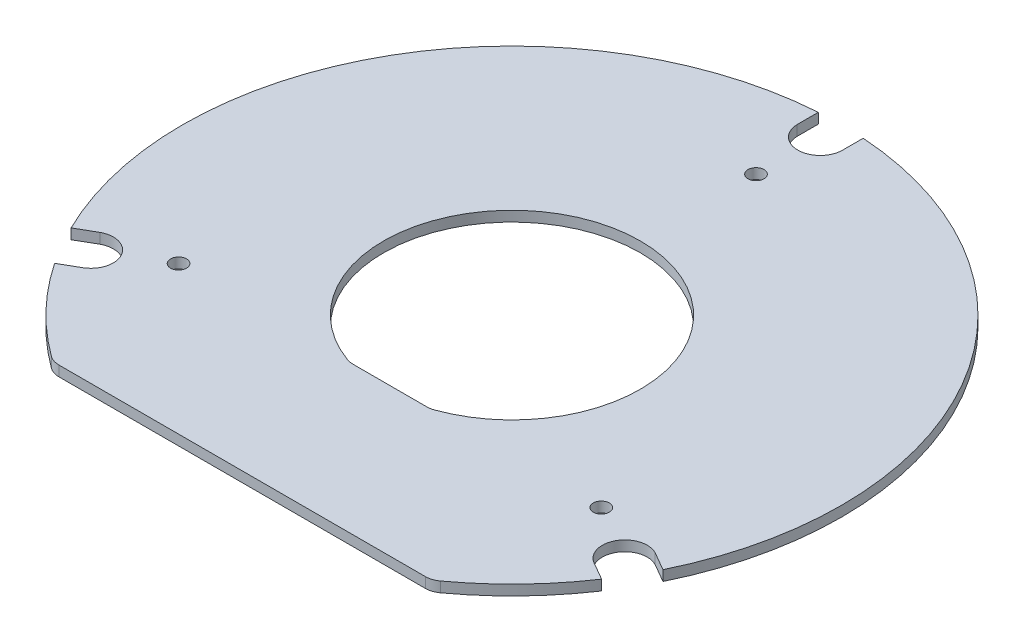
ISO-10303-21;
HEADER;
FILE_DESCRIPTION(('STEP AP214'),'2;1');
FILE_NAME('part.step','',(''),(''),'','','');
FILE_SCHEMA(('AUTOMOTIVE_DESIGN { 1 0 10303 214 1 1 1 1 }'));
ENDSEC;
DATA;
#1=APPLICATION_CONTEXT('core data for automotive mechanical design processes');
#2=APPLICATION_PROTOCOL_DEFINITION('international standard','automotive_design',2000,#1);
#3=PRODUCT_CONTEXT('',#1,'mechanical');
#4=PRODUCT('Part','Part','',(#3));
#5=PRODUCT_RELATED_PRODUCT_CATEGORY('part','',(#4));
#6=PRODUCT_DEFINITION_FORMATION('','',#4);
#7=PRODUCT_DEFINITION_CONTEXT('part definition',#1,'design');
#8=PRODUCT_DEFINITION('design','',#6,#7);
#9=PRODUCT_DEFINITION_SHAPE('','',#8);
#10=(LENGTH_UNIT() NAMED_UNIT(*) SI_UNIT(.MILLI.,.METRE.));
#11=(NAMED_UNIT(*) PLANE_ANGLE_UNIT() SI_UNIT($,.RADIAN.));
#12=(NAMED_UNIT(*) SI_UNIT($,.STERADIAN.) SOLID_ANGLE_UNIT());
#13=UNCERTAINTY_MEASURE_WITH_UNIT(LENGTH_MEASURE(1.E-05),#10,'distance_accuracy_value','');
#14=(GEOMETRIC_REPRESENTATION_CONTEXT(3) GLOBAL_UNCERTAINTY_ASSIGNED_CONTEXT((#13)) GLOBAL_UNIT_ASSIGNED_CONTEXT((#10,
#11,#12)) REPRESENTATION_CONTEXT('',''));
#15=CARTESIAN_POINT('',(0.,0.,0.));
#16=DIRECTION('',(0.,0.,1.));
#17=DIRECTION('',(1.,0.,0.));
#18=AXIS2_PLACEMENT_3D('',#15,#16,#17);
#19=CARTESIAN_POINT('',(0.,10.,42.0000000000002));
#20=DIRECTION('',(0.,0.,-1.));
#21=DIRECTION('',(-1.,0.,0.));
#22=AXIS2_PLACEMENT_3D('',#19,#20,#21);
#23=PLANE('',#22);
#24=DIRECTION('',(1.,0.,0.));
#25=VECTOR('',#24,1.);
#26=CARTESIAN_POINT('',(0.,10.,42.0000000000002));
#27=LINE('',#26,#25);
#28=CARTESIAN_POINT('',(-28.5132970067189,10.,42.0000000000002));
#29=VERTEX_POINT('',#28);
#30=CARTESIAN_POINT('',(28.5132970067189,10.,42.0000000000002));
#31=VERTEX_POINT('',#30);
#32=EDGE_CURVE('E190',#29,#31,#27,.T.);
#33=ORIENTED_EDGE('',*,*,#32,.F.);
#34=DIRECTION('',(0.,-1.,0.));
#35=VECTOR('',#34,1.);
#36=CARTESIAN_POINT('',(-28.5132970067189,10.,42.0000000000002));
#37=LINE('',#36,#35);
#38=CARTESIAN_POINT('',(-28.5132970067189,8.4,42.0000000000002));
#39=VERTEX_POINT('',#38);
#40=EDGE_CURVE('E304',#29,#39,#37,.T.);
#41=ORIENTED_EDGE('',*,*,#40,.T.);
#42=DIRECTION('',(1.,0.,0.));
#43=VECTOR('',#42,1.);
#44=CARTESIAN_POINT('',(0.,8.4,42.0000000000002));
#45=LINE('',#44,#43);
#46=CARTESIAN_POINT('',(28.5132970067189,8.4,42.0000000000002));
#47=VERTEX_POINT('',#46);
#48=EDGE_CURVE('E246',#39,#47,#45,.T.);
#49=ORIENTED_EDGE('',*,*,#48,.T.);
#50=DIRECTION('',(0.,-1.,0.));
#51=VECTOR('',#50,1.);
#52=CARTESIAN_POINT('',(28.5132970067189,10.,42.0000000000002));
#53=LINE('',#52,#51);
#54=EDGE_CURVE('E202',#47,#31,#53,.F.);
#55=ORIENTED_EDGE('',*,*,#54,.T.);
#56=EDGE_LOOP('',(#33,#41,#49,#55));
#57=FACE_BOUND('',#56,.T.);
#58=ADVANCED_FACE('F41',(#57),#23,.F.);
#59=CARTESIAN_POINT('',(0.,10.,0.));
#60=DIRECTION('',(0.,-1.,0.));
#61=DIRECTION('',(0.,0.,-1.));
#62=AXIS2_PLACEMENT_3D('',#59,#60,#61);
#63=CYLINDRICAL_SURFACE('',#62,51.3115732117407);
#64=CARTESIAN_POINT('',(0.,10.,0.));
#65=DIRECTION('',(0.,1.,0.));
#66=DIRECTION('',(0.,0.,1.));
#67=AXIS2_PLACEMENT_3D('',#64,#65,#66);
#68=CIRCLE('',#67,51.3115732117407);
#69=CARTESIAN_POINT('',(30.2838849907875,10.,41.4217799633065));
#70=VERTEX_POINT('',#69);
#71=CARTESIAN_POINT('',(42.5849301614049,10.,28.6251859140179));
#72=VERTEX_POINT('',#71);
#73=EDGE_CURVE('E178',#70,#72,#68,.T.);
#74=ORIENTED_EDGE('',*,*,#73,.F.);
#75=DIRECTION('',(0.,-1.,0.));
#76=VECTOR('',#75,1.);
#77=CARTESIAN_POINT('',(30.2838849907875,10.,41.4217799633065));
#78=LINE('',#77,#76);
#79=CARTESIAN_POINT('',(30.2838849907875,8.4,41.4217799633065));
#80=VERTEX_POINT('',#79);
#81=EDGE_CURVE('E316',#70,#80,#78,.T.);
#82=ORIENTED_EDGE('',*,*,#81,.T.);
#83=CARTESIAN_POINT('',(0.,8.4,0.));
#84=DIRECTION('',(0.,1.,0.));
#85=DIRECTION('',(0.,0.,1.));
#86=AXIS2_PLACEMENT_3D('',#83,#84,#85);
#87=CIRCLE('',#86,51.3115732117407);
#88=CARTESIAN_POINT('',(42.5849301614049,8.4,28.6251859140179));
#89=VERTEX_POINT('',#88);
#90=EDGE_CURVE('E198',#80,#89,#87,.T.);
#91=ORIENTED_EDGE('',*,*,#90,.T.);
#92=DIRECTION('',(0.,-1.,0.));
#93=VECTOR('',#92,1.);
#94=CARTESIAN_POINT('',(42.5849301614049,10.,28.6251859140179));
#95=LINE('',#94,#93);
#96=EDGE_CURVE('E195',#72,#89,#95,.T.);
#97=ORIENTED_EDGE('',*,*,#96,.F.);
#98=EDGE_LOOP('',(#74,#82,#91,#97));
#99=FACE_BOUND('',#98,.T.);
#100=ADVANCED_FACE('F196',(#99),#63,.T.);
#101=CARTESIAN_POINT('',(-1.74883655444479,10.,3.02907376643207));
#102=DIRECTION('',(0.5,0.,-0.866025403784439));
#103=DIRECTION('',(-0.866025403784439,0.,-0.5));
#104=AXIS2_PLACEMENT_3D('',#101,#102,#103);
#105=PLANE('',#104);
#106=DIRECTION('',(0.866025403784439,0.,0.5));
#107=VECTOR('',#106,1.);
#108=CARTESIAN_POINT('',(-1.74883655444479,8.4,3.02907376643207));
#109=LINE('',#108,#107);
#110=CARTESIAN_POINT('',(39.7098743772462,8.4,26.9652716830987));
#111=VERTEX_POINT('',#110);
#112=EDGE_CURVE('E250',#111,#89,#109,.T.);
#113=ORIENTED_EDGE('',*,*,#112,.F.);
#114=DIRECTION('',(0.,-1.,0.));
#115=VECTOR('',#114,1.);
#116=CARTESIAN_POINT('',(39.7098743772462,10.,26.9652716830987));
#117=LINE('',#116,#115);
#118=CARTESIAN_POINT('',(39.7098743772462,10.,26.9652716830987));
#119=VERTEX_POINT('',#118);
#120=EDGE_CURVE('E203',#119,#111,#117,.T.);
#121=ORIENTED_EDGE('',*,*,#120,.F.);
#122=DIRECTION('',(0.866025403784439,0.,0.5));
#123=VECTOR('',#122,1.);
#124=CARTESIAN_POINT('',(-1.74883655444479,10.,3.02907376643207));
#125=LINE('',#124,#123);
#126=EDGE_CURVE('E185',#119,#72,#125,.T.);
#127=ORIENTED_EDGE('',*,*,#126,.T.);
#128=ORIENTED_EDGE('',*,*,#96,.T.);
#129=EDGE_LOOP('',(#113,#121,#127,#128));
#130=FACE_BOUND('',#129,.T.);
#131=ADVANCED_FACE('F205',(#130),#105,.T.);
#132=CARTESIAN_POINT('',(41.5692193816531,10.,24.));
#133=DIRECTION('',(0.,-1.,0.));
#134=DIRECTION('',(0.,0.,-1.));
#135=AXIS2_PLACEMENT_3D('',#132,#133,#134);
#136=CYLINDRICAL_SURFACE('',#135,3.5);
#137=CARTESIAN_POINT('',(41.5692193816531,8.4,24.));
#138=DIRECTION('',(0.,1.,0.));
#139=DIRECTION('',(0.,0.,1.));
#140=AXIS2_PLACEMENT_3D('',#137,#138,#139);
#141=CIRCLE('',#140,3.5);
#142=CARTESIAN_POINT('',(43.2075474861358,8.4,20.9071241502346));
#143=VERTEX_POINT('',#142);
#144=EDGE_CURVE('E254',#143,#111,#141,.T.);
#145=ORIENTED_EDGE('',*,*,#144,.F.);
#146=DIRECTION('',(0.,-1.,0.));
#147=VECTOR('',#146,1.);
#148=CARTESIAN_POINT('',(43.2075474861358,10.,20.9071241502346));
#149=LINE('',#148,#147);
#150=CARTESIAN_POINT('',(43.2075474861358,10.,20.9071241502346));
#151=VERTEX_POINT('',#150);
#152=EDGE_CURVE('E300',#151,#143,#149,.T.);
#153=ORIENTED_EDGE('',*,*,#152,.F.);
#154=CARTESIAN_POINT('',(41.5692193816531,10.,24.));
#155=DIRECTION('',(0.,1.,0.));
#156=DIRECTION('',(0.,0.,1.));
#157=AXIS2_PLACEMENT_3D('',#154,#155,#156);
#158=CIRCLE('',#157,3.5);
#159=EDGE_CURVE('E206',#151,#119,#158,.T.);
#160=ORIENTED_EDGE('',*,*,#159,.T.);
#161=ORIENTED_EDGE('',*,*,#120,.T.);
#162=EDGE_LOOP('',(#145,#153,#160,#161));
#163=FACE_BOUND('',#162,.T.);
#164=ADVANCED_FACE('F370',(#163),#136,.F.);
#165=CARTESIAN_POINT('',(1.7488365544448,10.,-3.02907376643208));
#166=DIRECTION('',(0.5,0.,-0.866025403784439));
#167=DIRECTION('',(-0.866025403784439,0.,-0.5));
#168=AXIS2_PLACEMENT_3D('',#165,#166,#167);
#169=PLANE('',#168);
#170=DIRECTION('',(0.866025403784439,0.,0.5));
#171=VECTOR('',#170,1.);
#172=CARTESIAN_POINT('',(1.7488365544448,8.4,-3.02907376643208));
#173=LINE('',#172,#171);
#174=CARTESIAN_POINT('',(46.0826032702945,8.4,22.5670383811538));
#175=VERTEX_POINT('',#174);
#176=EDGE_CURVE('E257',#143,#175,#173,.T.);
#177=ORIENTED_EDGE('',*,*,#176,.T.);
#178=DIRECTION('',(0.,-1.,0.));
#179=VECTOR('',#178,1.);
#180=CARTESIAN_POINT('',(46.0826032702945,10.,22.5670383811538));
#181=LINE('',#180,#179);
#182=CARTESIAN_POINT('',(46.0826032702945,10.,22.5670383811538));
#183=VERTEX_POINT('',#182);
#184=EDGE_CURVE('E297',#183,#175,#181,.T.);
#185=ORIENTED_EDGE('',*,*,#184,.F.);
#186=DIRECTION('',(0.866025403784439,0.,0.5));
#187=VECTOR('',#186,1.);
#188=CARTESIAN_POINT('',(1.7488365544448,10.,-3.02907376643208));
#189=LINE('',#188,#187);
#190=EDGE_CURVE('E208',#151,#183,#189,.T.);
#191=ORIENTED_EDGE('',*,*,#190,.F.);
#192=ORIENTED_EDGE('',*,*,#152,.T.);
#193=EDGE_LOOP('',(#177,#185,#191,#192));
#194=FACE_BOUND('',#193,.T.);
#195=ADVANCED_FACE('F377',(#194),#169,.F.);
#196=CARTESIAN_POINT('',(3.49767310888958,8.4,-51.1922242951717));
#197=VERTEX_POINT('',#196);
#198=EDGE_CURVE('E252',#175,#197,#87,.T.);
#199=ORIENTED_EDGE('',*,*,#198,.T.);
#200=DIRECTION('',(0.,-1.,0.));
#201=VECTOR('',#200,1.);
#202=CARTESIAN_POINT('',(3.49767310888958,10.,-51.1922242951717));
#203=LINE('',#202,#201);
#204=CARTESIAN_POINT('',(3.49767310888958,10.,-51.1922242951717));
#205=VERTEX_POINT('',#204);
#206=EDGE_CURVE('E295',#205,#197,#203,.T.);
#207=ORIENTED_EDGE('',*,*,#206,.F.);
#208=EDGE_CURVE('E193',#183,#205,#68,.T.);
#209=ORIENTED_EDGE('',*,*,#208,.F.);
#210=ORIENTED_EDGE('',*,*,#184,.T.);
#211=EDGE_LOOP('',(#199,#207,#209,#210));
#212=FACE_BOUND('',#211,.T.);
#213=ADVANCED_FACE('F380',(#212),#63,.T.);
#214=CARTESIAN_POINT('',(3.49767310888958,10.,0.));
#215=DIRECTION('',(-1.,0.,0.));
#216=DIRECTION('',(0.,0.,1.));
#217=AXIS2_PLACEMENT_3D('',#214,#215,#216);
#218=PLANE('',#217);
#219=DIRECTION('',(0.,0.,-1.));
#220=VECTOR('',#219,1.);
#221=CARTESIAN_POINT('',(3.49767310888958,8.4,0.));
#222=LINE('',#221,#220);
#223=CARTESIAN_POINT('',(3.49767310888958,8.4,-47.8723958333333));
#224=VERTEX_POINT('',#223);
#225=EDGE_CURVE('E259',#224,#197,#222,.T.);
#226=ORIENTED_EDGE('',*,*,#225,.F.);
#227=DIRECTION('',(0.,-1.,0.));
#228=VECTOR('',#227,1.);
#229=CARTESIAN_POINT('',(3.49767310888958,10.,-47.8723958333333));
#230=LINE('',#229,#228);
#231=CARTESIAN_POINT('',(3.49767310888958,10.,-47.8723958333333));
#232=VERTEX_POINT('',#231);
#233=EDGE_CURVE('E293',#232,#224,#230,.T.);
#234=ORIENTED_EDGE('',*,*,#233,.F.);
#235=DIRECTION('',(0.,0.,-1.));
#236=VECTOR('',#235,1.);
#237=CARTESIAN_POINT('',(3.49767310888958,10.,0.));
#238=LINE('',#237,#236);
#239=EDGE_CURVE('E213',#232,#205,#238,.T.);
#240=ORIENTED_EDGE('',*,*,#239,.T.);
#241=ORIENTED_EDGE('',*,*,#206,.T.);
#242=EDGE_LOOP('',(#226,#234,#240,#241));
#243=FACE_BOUND('',#242,.T.);
#244=ADVANCED_FACE('F403',(#243),#218,.T.);
#245=CARTESIAN_POINT('',(0.,10.,-48.));
#246=DIRECTION('',(0.,-1.,0.));
#247=DIRECTION('',(0.,0.,-1.));
#248=AXIS2_PLACEMENT_3D('',#245,#246,#247);
#249=CYLINDRICAL_SURFACE('',#248,3.5);
#250=CARTESIAN_POINT('',(0.,8.4,-48.));
#251=DIRECTION('',(0.,1.,0.));
#252=DIRECTION('',(0.,0.,1.));
#253=AXIS2_PLACEMENT_3D('',#250,#251,#252);
#254=CIRCLE('',#253,3.5);
#255=CARTESIAN_POINT('',(-3.49767310888958,8.4,-47.8723958333333));
#256=VERTEX_POINT('',#255);
#257=EDGE_CURVE('E262',#256,#224,#254,.T.);
#258=ORIENTED_EDGE('',*,*,#257,.F.);
#259=DIRECTION('',(0.,-1.,0.));
#260=VECTOR('',#259,1.);
#261=CARTESIAN_POINT('',(-3.49767310888958,10.,-47.8723958333333));
#262=LINE('',#261,#260);
#263=CARTESIAN_POINT('',(-3.49767310888958,10.,-47.8723958333333));
#264=VERTEX_POINT('',#263);
#265=EDGE_CURVE('E291',#264,#256,#262,.T.);
#266=ORIENTED_EDGE('',*,*,#265,.F.);
#267=CARTESIAN_POINT('',(0.,10.,-48.));
#268=DIRECTION('',(0.,1.,0.));
#269=DIRECTION('',(0.,0.,1.));
#270=AXIS2_PLACEMENT_3D('',#267,#268,#269);
#271=CIRCLE('',#270,3.5);
#272=EDGE_CURVE('E216',#264,#232,#271,.T.);
#273=ORIENTED_EDGE('',*,*,#272,.T.);
#274=ORIENTED_EDGE('',*,*,#233,.T.);
#275=EDGE_LOOP('',(#258,#266,#273,#274));
#276=FACE_BOUND('',#275,.T.);
#277=ADVANCED_FACE('F406',(#276),#249,.F.);
#278=CARTESIAN_POINT('',(-3.49767310888958,10.,0.));
#279=DIRECTION('',(-1.,0.,0.));
#280=DIRECTION('',(0.,0.,1.));
#281=AXIS2_PLACEMENT_3D('',#278,#279,#280);
#282=PLANE('',#281);
#283=DIRECTION('',(0.,0.,-1.));
#284=VECTOR('',#283,1.);
#285=CARTESIAN_POINT('',(-3.49767310888958,8.4,0.));
#286=LINE('',#285,#284);
#287=CARTESIAN_POINT('',(-3.49767310888958,8.4,-51.1922242951717));
#288=VERTEX_POINT('',#287);
#289=EDGE_CURVE('E265',#256,#288,#286,.T.);
#290=ORIENTED_EDGE('',*,*,#289,.T.);
#291=DIRECTION('',(0.,-1.,0.));
#292=VECTOR('',#291,1.);
#293=CARTESIAN_POINT('',(-3.49767310888958,10.,-51.1922242951717));
#294=LINE('',#293,#292);
#295=CARTESIAN_POINT('',(-3.49767310888958,10.,-51.1922242951717));
#296=VERTEX_POINT('',#295);
#297=EDGE_CURVE('E288',#296,#288,#294,.T.);
#298=ORIENTED_EDGE('',*,*,#297,.F.);
#299=DIRECTION('',(0.,0.,-1.));
#300=VECTOR('',#299,1.);
#301=CARTESIAN_POINT('',(-3.49767310888958,10.,0.));
#302=LINE('',#301,#300);
#303=EDGE_CURVE('E219',#264,#296,#302,.T.);
#304=ORIENTED_EDGE('',*,*,#303,.F.);
#305=ORIENTED_EDGE('',*,*,#265,.T.);
#306=EDGE_LOOP('',(#290,#298,#304,#305));
#307=FACE_BOUND('',#306,.T.);
#308=ADVANCED_FACE('F410',(#307),#282,.F.);
#309=CARTESIAN_POINT('',(-46.0826032702944,8.4,22.5670383811538));
#310=VERTEX_POINT('',#309);
#311=EDGE_CURVE('E267',#288,#310,#87,.T.);
#312=ORIENTED_EDGE('',*,*,#311,.T.);
#313=DIRECTION('',(0.,-1.,0.));
#314=VECTOR('',#313,1.);
#315=CARTESIAN_POINT('',(-46.0826032702944,10.,22.5670383811538));
#316=LINE('',#315,#314);
#317=CARTESIAN_POINT('',(-46.0826032702944,10.,22.5670383811538));
#318=VERTEX_POINT('',#317);
#319=EDGE_CURVE('E286',#318,#310,#316,.T.);
#320=ORIENTED_EDGE('',*,*,#319,.F.);
#321=EDGE_CURVE('E221',#296,#318,#68,.T.);
#322=ORIENTED_EDGE('',*,*,#321,.F.);
#323=ORIENTED_EDGE('',*,*,#297,.T.);
#324=EDGE_LOOP('',(#312,#320,#322,#323));
#325=FACE_BOUND('',#324,.T.);
#326=ADVANCED_FACE('F411',(#325),#63,.T.);
#327=CARTESIAN_POINT('',(-1.74883655444477,10.,-3.02907376643205));
#328=DIRECTION('',(0.5,0.,0.866025403784439));
#329=DIRECTION('',(0.866025403784439,0.,-0.5));
#330=AXIS2_PLACEMENT_3D('',#327,#328,#329);
#331=PLANE('',#330);
#332=DIRECTION('',(-0.866025403784439,0.,0.5));
#333=VECTOR('',#332,1.);
#334=CARTESIAN_POINT('',(-1.74883655444477,8.4,-3.02907376643205));
#335=LINE('',#334,#333);
#336=CARTESIAN_POINT('',(-43.2075474861358,8.4,20.9071241502346));
#337=VERTEX_POINT('',#336);
#338=EDGE_CURVE('E268',#337,#310,#335,.T.);
#339=ORIENTED_EDGE('',*,*,#338,.F.);
#340=DIRECTION('',(0.,-1.,0.));
#341=VECTOR('',#340,1.);
#342=CARTESIAN_POINT('',(-43.2075474861358,10.,20.9071241502346));
#343=LINE('',#342,#341);
#344=CARTESIAN_POINT('',(-43.2075474861358,10.,20.9071241502346));
#345=VERTEX_POINT('',#344);
#346=EDGE_CURVE('E284',#345,#337,#343,.T.);
#347=ORIENTED_EDGE('',*,*,#346,.F.);
#348=DIRECTION('',(-0.866025403784439,0.,0.5));
#349=VECTOR('',#348,1.);
#350=CARTESIAN_POINT('',(-1.74883655444477,10.,-3.02907376643205));
#351=LINE('',#350,#349);
#352=EDGE_CURVE('E222',#345,#318,#351,.T.);
#353=ORIENTED_EDGE('',*,*,#352,.T.);
#354=ORIENTED_EDGE('',*,*,#319,.T.);
#355=EDGE_LOOP('',(#339,#347,#353,#354));
#356=FACE_BOUND('',#355,.T.);
#357=ADVANCED_FACE('F414',(#356),#331,.T.);
#358=CARTESIAN_POINT('',(-41.5692193816531,10.,24.));
#359=DIRECTION('',(0.,-1.,0.));
#360=DIRECTION('',(0.,0.,-1.));
#361=AXIS2_PLACEMENT_3D('',#358,#359,#360);
#362=CYLINDRICAL_SURFACE('',#361,3.5);
#363=CARTESIAN_POINT('',(-41.5692193816531,8.4,24.));
#364=DIRECTION('',(0.,1.,0.));
#365=DIRECTION('',(0.,0.,1.));
#366=AXIS2_PLACEMENT_3D('',#363,#364,#365);
#367=CIRCLE('',#366,3.5);
#368=CARTESIAN_POINT('',(-39.7098743772462,8.4,26.9652716830988));
#369=VERTEX_POINT('',#368);
#370=EDGE_CURVE('E271',#369,#337,#367,.T.);
#371=ORIENTED_EDGE('',*,*,#370,.F.);
#372=DIRECTION('',(0.,-1.,0.));
#373=VECTOR('',#372,1.);
#374=CARTESIAN_POINT('',(-39.7098743772462,10.,26.9652716830988));
#375=LINE('',#374,#373);
#376=CARTESIAN_POINT('',(-39.7098743772462,10.,26.9652716830988));
#377=VERTEX_POINT('',#376);
#378=EDGE_CURVE('E282',#377,#369,#375,.T.);
#379=ORIENTED_EDGE('',*,*,#378,.F.);
#380=CARTESIAN_POINT('',(-41.5692193816531,10.,24.));
#381=DIRECTION('',(0.,1.,0.));
#382=DIRECTION('',(0.,0.,1.));
#383=AXIS2_PLACEMENT_3D('',#380,#381,#382);
#384=CIRCLE('',#383,3.5);
#385=EDGE_CURVE('E225',#377,#345,#384,.T.);
#386=ORIENTED_EDGE('',*,*,#385,.T.);
#387=ORIENTED_EDGE('',*,*,#346,.T.);
#388=EDGE_LOOP('',(#371,#379,#386,#387));
#389=FACE_BOUND('',#388,.T.);
#390=ADVANCED_FACE('F417',(#389),#362,.F.);
#391=CARTESIAN_POINT('',(1.7488365544448,10.,3.0290737664321));
#392=DIRECTION('',(0.5,0.,0.866025403784439));
#393=DIRECTION('',(0.866025403784439,0.,-0.5));
#394=AXIS2_PLACEMENT_3D('',#391,#392,#393);
#395=PLANE('',#394);
#396=DIRECTION('',(-0.866025403784439,0.,0.5));
#397=VECTOR('',#396,1.);
#398=CARTESIAN_POINT('',(1.7488365544448,8.4,3.0290737664321));
#399=LINE('',#398,#397);
#400=CARTESIAN_POINT('',(-42.5849301614049,8.4,28.625185914018));
#401=VERTEX_POINT('',#400);
#402=EDGE_CURVE('E274',#369,#401,#399,.T.);
#403=ORIENTED_EDGE('',*,*,#402,.T.);
#404=DIRECTION('',(0.,-1.,0.));
#405=VECTOR('',#404,1.);
#406=CARTESIAN_POINT('',(-42.5849301614049,10.,28.625185914018));
#407=LINE('',#406,#405);
#408=CARTESIAN_POINT('',(-42.5849301614049,10.,28.625185914018));
#409=VERTEX_POINT('',#408);
#410=EDGE_CURVE('E233',#409,#401,#407,.T.);
#411=ORIENTED_EDGE('',*,*,#410,.F.);
#412=DIRECTION('',(-0.866025403784439,0.,0.5));
#413=VECTOR('',#412,1.);
#414=CARTESIAN_POINT('',(1.7488365544448,10.,3.0290737664321));
#415=LINE('',#414,#413);
#416=EDGE_CURVE('E228',#377,#409,#415,.T.);
#417=ORIENTED_EDGE('',*,*,#416,.F.);
#418=ORIENTED_EDGE('',*,*,#378,.T.);
#419=EDGE_LOOP('',(#403,#411,#417,#418));
#420=FACE_BOUND('',#419,.T.);
#421=ADVANCED_FACE('F419',(#420),#395,.F.);
#422=CARTESIAN_POINT('',(0.,10.,0.));
#423=DIRECTION('',(0.,-1.,0.));
#424=DIRECTION('',(0.,0.,-1.));
#425=AXIS2_PLACEMENT_3D('',#422,#423,#424);
#426=CYLINDRICAL_SURFACE('',#425,20.);
#427=CARTESIAN_POINT('',(0.,8.4,0.));
#428=DIRECTION('',(0.,1.,0.));
#429=DIRECTION('',(0.,0.,1.));
#430=AXIS2_PLACEMENT_3D('',#427,#428,#429);
#431=CIRCLE('',#430,20.);
#432=CARTESIAN_POINT('',(6.75830899592657,8.4,18.8235294117649));
#433=VERTEX_POINT('',#432);
#434=CARTESIAN_POINT('',(-6.75830899592657,8.4,18.8235294117649));
#435=VERTEX_POINT('',#434);
#436=EDGE_CURVE('E234',#433,#435,#431,.T.);
#437=ORIENTED_EDGE('',*,*,#436,.F.);
#438=DIRECTION('',(0.,-1.,0.));
#439=VECTOR('',#438,1.);
#440=CARTESIAN_POINT('',(6.75830899592657,10.,18.8235294117649));
#441=LINE('',#440,#439);
#442=CARTESIAN_POINT('',(6.75830899592657,10.,18.8235294117649));
#443=VERTEX_POINT('',#442);
#444=EDGE_CURVE('E326',#433,#443,#441,.F.);
#445=ORIENTED_EDGE('',*,*,#444,.T.);
#446=CARTESIAN_POINT('',(0.,10.,0.));
#447=DIRECTION('',(0.,1.,0.));
#448=DIRECTION('',(0.,0.,1.));
#449=AXIS2_PLACEMENT_3D('',#446,#447,#448);
#450=CIRCLE('',#449,20.);
#451=CARTESIAN_POINT('',(-6.75830899592657,10.,18.8235294117649));
#452=VERTEX_POINT('',#451);
#453=EDGE_CURVE('E279',#443,#452,#450,.T.);
#454=ORIENTED_EDGE('',*,*,#453,.T.);
#455=DIRECTION('',(0.,-1.,0.));
#456=VECTOR('',#455,1.);
#457=CARTESIAN_POINT('',(-6.75830899592657,10.,18.8235294117649));
#458=LINE('',#457,#456);
#459=EDGE_CURVE('E323',#452,#435,#458,.T.);
#460=ORIENTED_EDGE('',*,*,#459,.T.);
#461=EDGE_LOOP('',(#437,#445,#454,#460));
#462=FACE_BOUND('',#461,.T.);
#463=ADVANCED_FACE('F346',(#462),#426,.F.);
#464=CARTESIAN_POINT('',(-30.2838849907875,8.4,41.4217799633065));
#465=VERTEX_POINT('',#464);
#466=EDGE_CURVE('E251',#401,#465,#87,.T.);
#467=ORIENTED_EDGE('',*,*,#466,.T.);
#468=DIRECTION('',(0.,-1.,0.));
#469=VECTOR('',#468,1.);
#470=CARTESIAN_POINT('',(-30.2838849907875,10.,41.4217799633065));
#471=LINE('',#470,#469);
#472=CARTESIAN_POINT('',(-30.2838849907875,10.,41.4217799633065));
#473=VERTEX_POINT('',#472);
#474=EDGE_CURVE('E311',#465,#473,#471,.F.);
#475=ORIENTED_EDGE('',*,*,#474,.T.);
#476=EDGE_CURVE('E192',#409,#473,#68,.T.);
#477=ORIENTED_EDGE('',*,*,#476,.F.);
#478=ORIENTED_EDGE('',*,*,#410,.T.);
#479=EDGE_LOOP('',(#467,#475,#477,#478));
#480=FACE_BOUND('',#479,.T.);
#481=ADVANCED_FACE('F395',(#480),#63,.T.);
#482=CARTESIAN_POINT('',(-32.9089653438088,10.,18.9999999999997));
#483=DIRECTION('',(0.,-1.,0.));
#484=DIRECTION('',(0.,0.,-1.));
#485=AXIS2_PLACEMENT_3D('',#482,#483,#484);
#486=CYLINDRICAL_SURFACE('',#485,1.25);
#487=CARTESIAN_POINT('',(-32.9089653438088,10.,18.9999999999997));
#488=DIRECTION('',(0.,1.,0.));
#489=DIRECTION('',(0.,0.,1.));
#490=AXIS2_PLACEMENT_3D('',#487,#488,#489);
#491=CIRCLE('',#490,1.25);
#492=CARTESIAN_POINT('',(-32.9089653438088,10.,20.2499999999997));
#493=VERTEX_POINT('',#492);
#494=EDGE_CURVE('E354',#493,#493,#491,.T.);
#495=ORIENTED_EDGE('',*,*,#494,.T.);
#496=EDGE_LOOP('',(#495));
#497=FACE_BOUND('',#496,.T.);
#498=CARTESIAN_POINT('',(-32.9089653438088,8.4,18.9999999999997));
#499=DIRECTION('',(0.,1.,0.));
#500=DIRECTION('',(0.,0.,1.));
#501=AXIS2_PLACEMENT_3D('',#498,#499,#500);
#502=CIRCLE('',#501,1.25);
#503=CARTESIAN_POINT('',(-32.9089653438088,8.4,20.2499999999997));
#504=VERTEX_POINT('',#503);
#505=EDGE_CURVE('E243',#504,#504,#502,.T.);
#506=ORIENTED_EDGE('',*,*,#505,.F.);
#507=EDGE_LOOP('',(#506));
#508=FACE_BOUND('',#507,.T.);
#509=ADVANCED_FACE('F437',(#497,#508),#486,.F.);
#510=CARTESIAN_POINT('',(0.,10.,-38.));
#511=DIRECTION('',(0.,-1.,0.));
#512=DIRECTION('',(0.,0.,-1.));
#513=AXIS2_PLACEMENT_3D('',#510,#511,#512);
#514=CYLINDRICAL_SURFACE('',#513,1.25);
#515=CARTESIAN_POINT('',(0.,10.,-38.));
#516=DIRECTION('',(0.,1.,0.));
#517=DIRECTION('',(0.,0.,1.));
#518=AXIS2_PLACEMENT_3D('',#515,#516,#517);
#519=CIRCLE('',#518,1.25);
#520=CARTESIAN_POINT('',(0.,10.,-36.75));
#521=VERTEX_POINT('',#520);
#522=EDGE_CURVE('E349',#521,#521,#519,.T.);
#523=ORIENTED_EDGE('',*,*,#522,.T.);
#524=EDGE_LOOP('',(#523));
#525=FACE_BOUND('',#524,.T.);
#526=CARTESIAN_POINT('',(0.,8.4,-38.));
#527=DIRECTION('',(0.,1.,0.));
#528=DIRECTION('',(0.,0.,1.));
#529=AXIS2_PLACEMENT_3D('',#526,#527,#528);
#530=CIRCLE('',#529,1.25);
#531=CARTESIAN_POINT('',(0.,8.4,-36.75));
#532=VERTEX_POINT('',#531);
#533=EDGE_CURVE('E240',#532,#532,#530,.T.);
#534=ORIENTED_EDGE('',*,*,#533,.F.);
#535=EDGE_LOOP('',(#534));
#536=FACE_BOUND('',#535,.T.);
#537=ADVANCED_FACE('F440',(#525,#536),#514,.F.);
#538=CARTESIAN_POINT('',(0.,10.,19.0000000000002));
#539=DIRECTION('',(0.,0.,-1.));
#540=DIRECTION('',(-1.,0.,0.));
#541=AXIS2_PLACEMENT_3D('',#538,#539,#540);
#542=PLANE('',#541);
#543=DIRECTION('',(1.,0.,0.));
#544=VECTOR('',#543,1.);
#545=CARTESIAN_POINT('',(0.,10.,19.0000000000002));
#546=LINE('',#545,#544);
#547=CARTESIAN_POINT('',(-5.74456264653758,10.,19.0000000000002));
#548=VERTEX_POINT('',#547);
#549=CARTESIAN_POINT('',(5.74456264653758,10.,19.0000000000002));
#550=VERTEX_POINT('',#549);
#551=EDGE_CURVE('E344',#548,#550,#546,.T.);
#552=ORIENTED_EDGE('',*,*,#551,.T.);
#553=DIRECTION('',(0.,1.,0.));
#554=VECTOR('',#553,1.);
#555=CARTESIAN_POINT('',(5.74456264653758,8.4,19.0000000000002));
#556=LINE('',#555,#554);
#557=CARTESIAN_POINT('',(5.74456264653758,8.4,19.0000000000002));
#558=VERTEX_POINT('',#557);
#559=EDGE_CURVE('E320',#550,#558,#556,.F.);
#560=ORIENTED_EDGE('',*,*,#559,.T.);
#561=DIRECTION('',(1.,0.,0.));
#562=VECTOR('',#561,1.);
#563=CARTESIAN_POINT('',(0.,8.4,19.0000000000002));
#564=LINE('',#563,#562);
#565=CARTESIAN_POINT('',(-5.74456264653758,8.4,19.0000000000002));
#566=VERTEX_POINT('',#565);
#567=EDGE_CURVE('E237',#566,#558,#564,.T.);
#568=ORIENTED_EDGE('',*,*,#567,.F.);
#569=DIRECTION('',(0.,1.,0.));
#570=VECTOR('',#569,1.);
#571=CARTESIAN_POINT('',(-5.74456264653758,10.,19.0000000000002));
#572=LINE('',#571,#570);
#573=EDGE_CURVE('E318',#566,#548,#572,.T.);
#574=ORIENTED_EDGE('',*,*,#573,.T.);
#575=EDGE_LOOP('',(#552,#560,#568,#574));
#576=FACE_BOUND('',#575,.T.);
#577=ADVANCED_FACE('F339',(#576),#542,.T.);
#578=CARTESIAN_POINT('',(32.9089653438086,10.,19.0000000000002));
#579=DIRECTION('',(0.,-1.,0.));
#580=DIRECTION('',(0.,0.,-1.));
#581=AXIS2_PLACEMENT_3D('',#578,#579,#580);
#582=CYLINDRICAL_SURFACE('',#581,1.25);
#583=CARTESIAN_POINT('',(32.9089653438086,10.,19.0000000000002));
#584=DIRECTION('',(0.,1.,0.));
#585=DIRECTION('',(0.,0.,1.));
#586=AXIS2_PLACEMENT_3D('',#583,#584,#585);
#587=CIRCLE('',#586,1.25);
#588=CARTESIAN_POINT('',(32.9089653438086,10.,20.2500000000002));
#589=VERTEX_POINT('',#588);
#590=EDGE_CURVE('E230',#589,#589,#587,.T.);
#591=ORIENTED_EDGE('',*,*,#590,.T.);
#592=EDGE_LOOP('',(#591));
#593=FACE_BOUND('',#592,.T.);
#594=CARTESIAN_POINT('',(32.9089653438086,8.4,19.0000000000002));
#595=DIRECTION('',(0.,1.,0.));
#596=DIRECTION('',(0.,0.,1.));
#597=AXIS2_PLACEMENT_3D('',#594,#595,#596);
#598=CIRCLE('',#597,1.25);
#599=CARTESIAN_POINT('',(32.9089653438086,8.4,20.2500000000002));
#600=VERTEX_POINT('',#599);
#601=EDGE_CURVE('E276',#600,#600,#598,.T.);
#602=ORIENTED_EDGE('',*,*,#601,.F.);
#603=EDGE_LOOP('',(#602));
#604=FACE_BOUND('',#603,.T.);
#605=ADVANCED_FACE('F446',(#593,#604),#582,.F.);
#606=CARTESIAN_POINT('',(0.,10.,0.));
#607=DIRECTION('',(0.,1.,0.));
#608=DIRECTION('',(0.,0.,1.));
#609=AXIS2_PLACEMENT_3D('',#606,#607,#608);
#610=PLANE('',#609);
#611=ORIENTED_EDGE('',*,*,#453,.F.);
#612=CARTESIAN_POINT('',(5.74456264653758,10.,16.0000000000002));
#613=DIRECTION('',(0.,1.,0.));
#614=DIRECTION('',(0.,0.,1.));
#615=AXIS2_PLACEMENT_3D('',#612,#613,#614);
#616=CIRCLE('',#615,3.);
#617=EDGE_CURVE('E64',#443,#550,#616,.F.);
#618=ORIENTED_EDGE('',*,*,#617,.T.);
#619=ORIENTED_EDGE('',*,*,#551,.F.);
#620=CARTESIAN_POINT('',(-5.74456264653758,10.,16.0000000000002));
#621=DIRECTION('',(0.,1.,0.));
#622=DIRECTION('',(0.,0.,1.));
#623=AXIS2_PLACEMENT_3D('',#620,#621,#622);
#624=CIRCLE('',#623,3.);
#625=EDGE_CURVE('E11',#548,#452,#624,.F.);
#626=ORIENTED_EDGE('',*,*,#625,.T.);
#627=EDGE_LOOP('',(#611,#618,#619,#626));
#628=FACE_BOUND('',#627,.T.);
#629=ORIENTED_EDGE('',*,*,#522,.F.);
#630=EDGE_LOOP('',(#629));
#631=FACE_BOUND('',#630,.T.);
#632=ORIENTED_EDGE('',*,*,#494,.F.);
#633=EDGE_LOOP('',(#632));
#634=FACE_BOUND('',#633,.T.);
#635=ORIENTED_EDGE('',*,*,#476,.T.);
#636=CARTESIAN_POINT('',(-28.5132970067189,10.,39.0000000000002));
#637=DIRECTION('',(0.,1.,0.));
#638=DIRECTION('',(0.,0.,1.));
#639=AXIS2_PLACEMENT_3D('',#636,#637,#638);
#640=CIRCLE('',#639,3.);
#641=EDGE_CURVE('E314',#473,#29,#640,.T.);
#642=ORIENTED_EDGE('',*,*,#641,.T.);
#643=ORIENTED_EDGE('',*,*,#32,.T.);
#644=CARTESIAN_POINT('',(28.5132970067189,10.,39.0000000000002));
#645=DIRECTION('',(0.,1.,0.));
#646=DIRECTION('',(0.,0.,1.));
#647=AXIS2_PLACEMENT_3D('',#644,#645,#646);
#648=CIRCLE('',#647,3.);
#649=EDGE_CURVE('E56',#31,#70,#648,.T.);
#650=ORIENTED_EDGE('',*,*,#649,.T.);
#651=ORIENTED_EDGE('',*,*,#73,.T.);
#652=ORIENTED_EDGE('',*,*,#126,.F.);
#653=ORIENTED_EDGE('',*,*,#159,.F.);
#654=ORIENTED_EDGE('',*,*,#190,.T.);
#655=ORIENTED_EDGE('',*,*,#208,.T.);
#656=ORIENTED_EDGE('',*,*,#239,.F.);
#657=ORIENTED_EDGE('',*,*,#272,.F.);
#658=ORIENTED_EDGE('',*,*,#303,.T.);
#659=ORIENTED_EDGE('',*,*,#321,.T.);
#660=ORIENTED_EDGE('',*,*,#352,.F.);
#661=ORIENTED_EDGE('',*,*,#385,.F.);
#662=ORIENTED_EDGE('',*,*,#416,.T.);
#663=EDGE_LOOP('',(#635,#642,#643,#650,#651,#652,#653,#654,#655,#656,#657,#658,#659,#660,#661,#662));
#664=FACE_BOUND('',#663,.T.);
#665=ORIENTED_EDGE('',*,*,#590,.F.);
#666=EDGE_LOOP('',(#665));
#667=FACE_BOUND('',#666,.T.);
#668=ADVANCED_FACE('F181',(#628,#631,#634,#664,#667),#610,.T.);
#669=CARTESIAN_POINT('',(0.,8.4,0.));
#670=DIRECTION('',(0.,1.,0.));
#671=DIRECTION('',(0.,0.,1.));
#672=AXIS2_PLACEMENT_3D('',#669,#670,#671);
#673=PLANE('',#672);
#674=ORIENTED_EDGE('',*,*,#567,.T.);
#675=CARTESIAN_POINT('',(5.74456264653758,8.4,16.0000000000002));
#676=DIRECTION('',(0.,1.,0.));
#677=DIRECTION('',(0.,0.,1.));
#678=AXIS2_PLACEMENT_3D('',#675,#676,#677);
#679=CIRCLE('',#678,3.);
#680=EDGE_CURVE('E328',#558,#433,#679,.T.);
#681=ORIENTED_EDGE('',*,*,#680,.T.);
#682=ORIENTED_EDGE('',*,*,#436,.T.);
#683=CARTESIAN_POINT('',(-5.74456264653758,8.4,16.0000000000002));
#684=DIRECTION('',(0.,1.,0.));
#685=DIRECTION('',(0.,0.,1.));
#686=AXIS2_PLACEMENT_3D('',#683,#684,#685);
#687=CIRCLE('',#686,3.);
#688=EDGE_CURVE('E49',#435,#566,#687,.T.);
#689=ORIENTED_EDGE('',*,*,#688,.T.);
#690=EDGE_LOOP('',(#674,#681,#682,#689));
#691=FACE_BOUND('',#690,.T.);
#692=ORIENTED_EDGE('',*,*,#533,.T.);
#693=EDGE_LOOP('',(#692));
#694=FACE_BOUND('',#693,.T.);
#695=ORIENTED_EDGE('',*,*,#505,.T.);
#696=EDGE_LOOP('',(#695));
#697=FACE_BOUND('',#696,.T.);
#698=ORIENTED_EDGE('',*,*,#48,.F.);
#699=CARTESIAN_POINT('',(-28.5132970067189,8.4,39.0000000000002));
#700=DIRECTION('',(0.,1.,0.));
#701=DIRECTION('',(0.,0.,1.));
#702=AXIS2_PLACEMENT_3D('',#699,#700,#701);
#703=CIRCLE('',#702,3.);
#704=EDGE_CURVE('E309',#39,#465,#703,.F.);
#705=ORIENTED_EDGE('',*,*,#704,.T.);
#706=ORIENTED_EDGE('',*,*,#466,.F.);
#707=ORIENTED_EDGE('',*,*,#402,.F.);
#708=ORIENTED_EDGE('',*,*,#370,.T.);
#709=ORIENTED_EDGE('',*,*,#338,.T.);
#710=ORIENTED_EDGE('',*,*,#311,.F.);
#711=ORIENTED_EDGE('',*,*,#289,.F.);
#712=ORIENTED_EDGE('',*,*,#257,.T.);
#713=ORIENTED_EDGE('',*,*,#225,.T.);
#714=ORIENTED_EDGE('',*,*,#198,.F.);
#715=ORIENTED_EDGE('',*,*,#176,.F.);
#716=ORIENTED_EDGE('',*,*,#144,.T.);
#717=ORIENTED_EDGE('',*,*,#112,.T.);
#718=ORIENTED_EDGE('',*,*,#90,.F.);
#719=CARTESIAN_POINT('',(28.5132970067189,8.4,39.0000000000002));
#720=DIRECTION('',(0.,1.,0.));
#721=DIRECTION('',(0.,0.,1.));
#722=AXIS2_PLACEMENT_3D('',#719,#720,#721);
#723=CIRCLE('',#722,3.);
#724=EDGE_CURVE('E307',#80,#47,#723,.F.);
#725=ORIENTED_EDGE('',*,*,#724,.T.);
#726=EDGE_LOOP('',(#698,#705,#706,#707,#708,#709,#710,#711,#712,#713,#714,#715,#716,#717,#718,#725));
#727=FACE_BOUND('',#726,.T.);
#728=ORIENTED_EDGE('',*,*,#601,.T.);
#729=EDGE_LOOP('',(#728));
#730=FACE_BOUND('',#729,.T.);
#731=ADVANCED_FACE('F332',(#691,#694,#697,#727,#730),#673,.F.);
#732=CARTESIAN_POINT('',(-28.5132970067189,10.,39.0000000000002));
#733=DIRECTION('',(0.,-1.,0.));
#734=DIRECTION('',(0.,0.,-1.));
#735=AXIS2_PLACEMENT_3D('',#732,#733,#734);
#736=CYLINDRICAL_SURFACE('',#735,3.);
#737=ORIENTED_EDGE('',*,*,#641,.F.);
#738=ORIENTED_EDGE('',*,*,#474,.F.);
#739=ORIENTED_EDGE('',*,*,#704,.F.);
#740=ORIENTED_EDGE('',*,*,#40,.F.);
#741=EDGE_LOOP('',(#737,#738,#739,#740));
#742=FACE_BOUND('',#741,.T.);
#743=ADVANCED_FACE('F391',(#742),#736,.T.);
#744=CARTESIAN_POINT('',(28.5132970067189,10.,39.0000000000002));
#745=DIRECTION('',(0.,-1.,0.));
#746=DIRECTION('',(0.,0.,-1.));
#747=AXIS2_PLACEMENT_3D('',#744,#745,#746);
#748=CYLINDRICAL_SURFACE('',#747,3.);
#749=ORIENTED_EDGE('',*,*,#649,.F.);
#750=ORIENTED_EDGE('',*,*,#54,.F.);
#751=ORIENTED_EDGE('',*,*,#724,.F.);
#752=ORIENTED_EDGE('',*,*,#81,.F.);
#753=EDGE_LOOP('',(#749,#750,#751,#752));
#754=FACE_BOUND('',#753,.T.);
#755=ADVANCED_FACE('F362',(#754),#748,.T.);
#756=CARTESIAN_POINT('',(5.74456264653758,10.,16.0000000000002));
#757=DIRECTION('',(0.,-1.,0.));
#758=DIRECTION('',(0.,0.,-1.));
#759=AXIS2_PLACEMENT_3D('',#756,#757,#758);
#760=CYLINDRICAL_SURFACE('',#759,3.);
#761=ORIENTED_EDGE('',*,*,#617,.F.);
#762=ORIENTED_EDGE('',*,*,#444,.F.);
#763=ORIENTED_EDGE('',*,*,#680,.F.);
#764=ORIENTED_EDGE('',*,*,#559,.F.);
#765=EDGE_LOOP('',(#761,#762,#763,#764));
#766=FACE_BOUND('',#765,.T.);
#767=ADVANCED_FACE('F451',(#766),#760,.F.);
#768=CARTESIAN_POINT('',(-5.74456264653758,10.,16.0000000000002));
#769=DIRECTION('',(0.,-1.,0.));
#770=DIRECTION('',(0.,0.,-1.));
#771=AXIS2_PLACEMENT_3D('',#768,#769,#770);
#772=CYLINDRICAL_SURFACE('',#771,3.);
#773=ORIENTED_EDGE('',*,*,#625,.F.);
#774=ORIENTED_EDGE('',*,*,#573,.F.);
#775=ORIENTED_EDGE('',*,*,#688,.F.);
#776=ORIENTED_EDGE('',*,*,#459,.F.);
#777=EDGE_LOOP('',(#773,#774,#775,#776));
#778=FACE_BOUND('',#777,.T.);
#779=ADVANCED_FACE('F43',(#778),#772,.F.);
#780=CLOSED_SHELL('',(#58,#100,#131,#164,#195,#213,#244,#277,#308,#326,#357,#390,#421,#463,#481,
#509,#537,#577,#605,#668,#731,#743,#755,#767,#779));
#781=MANIFOLD_SOLID_BREP('B2',#780);
#782=ADVANCED_BREP_SHAPE_REPRESENTATION('',(#18,#781),#14);
#783=SHAPE_DEFINITION_REPRESENTATION(#9,#782);
ENDSEC;
END-ISO-10303-21;
